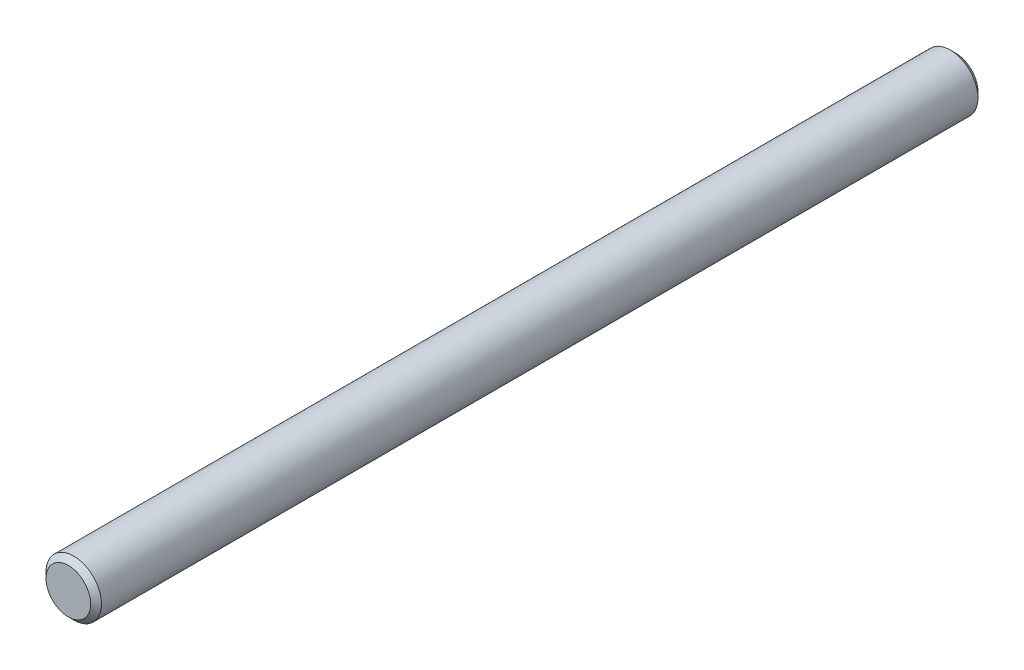
ISO-10303-21;
HEADER;
FILE_DESCRIPTION(('STEP AP214'),'2;1');
FILE_NAME('part.step','',(''),(''),'','','');
FILE_SCHEMA(('AUTOMOTIVE_DESIGN { 1 0 10303 214 1 1 1 1 }'));
ENDSEC;
DATA;
#1=APPLICATION_CONTEXT('core data for automotive mechanical design processes');
#2=APPLICATION_PROTOCOL_DEFINITION('international standard','automotive_design',2000,#1);
#3=PRODUCT_CONTEXT('',#1,'mechanical');
#4=PRODUCT('Part','Part','',(#3));
#5=PRODUCT_RELATED_PRODUCT_CATEGORY('part','',(#4));
#6=PRODUCT_DEFINITION_FORMATION('','',#4);
#7=PRODUCT_DEFINITION_CONTEXT('part definition',#1,'design');
#8=PRODUCT_DEFINITION('design','',#6,#7);
#9=PRODUCT_DEFINITION_SHAPE('','',#8);
#10=(LENGTH_UNIT() NAMED_UNIT(*) SI_UNIT(.MILLI.,.METRE.));
#11=(NAMED_UNIT(*) PLANE_ANGLE_UNIT() SI_UNIT($,.RADIAN.));
#12=(NAMED_UNIT(*) SI_UNIT($,.STERADIAN.) SOLID_ANGLE_UNIT());
#13=UNCERTAINTY_MEASURE_WITH_UNIT(LENGTH_MEASURE(1.E-05),#10,'distance_accuracy_value','');
#14=(GEOMETRIC_REPRESENTATION_CONTEXT(3) GLOBAL_UNCERTAINTY_ASSIGNED_CONTEXT((#13)) GLOBAL_UNIT_ASSIGNED_CONTEXT((#10,
#11,#12)) REPRESENTATION_CONTEXT('',''));
#15=CARTESIAN_POINT('',(0.,0.,0.));
#16=DIRECTION('',(0.,0.,1.));
#17=DIRECTION('',(1.,0.,0.));
#18=AXIS2_PLACEMENT_3D('',#15,#16,#17);
#19=CARTESIAN_POINT('',(0.,0.,40.));
#20=DIRECTION('',(0.,0.,-1.));
#21=DIRECTION('',(-1.,0.,0.));
#22=AXIS2_PLACEMENT_3D('',#19,#20,#21);
#23=PLANE('',#22);
#24=CARTESIAN_POINT('',(0.,0.,40.));
#25=DIRECTION('',(0.,0.,-1.));
#26=DIRECTION('',(-1.,0.,0.));
#27=AXIS2_PLACEMENT_3D('',#24,#25,#26);
#28=CIRCLE('',#27,1.0064375);
#29=CARTESIAN_POINT('',(-1.0064375,0.,40.));
#30=VERTEX_POINT('',#29);
#31=EDGE_CURVE('E10',#30,#30,#28,.T.);
#32=ORIENTED_EDGE('',*,*,#31,.F.);
#33=EDGE_LOOP('',(#32));
#34=FACE_BOUND('',#33,.T.);
#35=ADVANCED_FACE('F14',(#34),#23,.F.);
#36=CARTESIAN_POINT('',(0.,0.,40.));
#37=DIRECTION('',(0.,0.,-1.));
#38=DIRECTION('',(-1.,0.,0.));
#39=AXIS2_PLACEMENT_3D('',#36,#37,#38);
#40=CONICAL_SURFACE('',#39,1.0064375,0.785398163397442);
#41=CARTESIAN_POINT('',(0.,0.,39.7564375));
#42=DIRECTION('',(0.,0.,-1.));
#43=DIRECTION('',(-1.,0.,0.));
#44=AXIS2_PLACEMENT_3D('',#41,#42,#43);
#45=CIRCLE('',#44,1.25);
#46=CARTESIAN_POINT('',(-1.25,0.,39.7564375));
#47=VERTEX_POINT('',#46);
#48=EDGE_CURVE('E21',#47,#47,#45,.T.);
#49=ORIENTED_EDGE('',*,*,#48,.F.);
#50=EDGE_LOOP('',(#49));
#51=FACE_BOUND('',#50,.T.);
#52=ORIENTED_EDGE('',*,*,#31,.T.);
#53=EDGE_LOOP('',(#52));
#54=FACE_BOUND('',#53,.T.);
#55=ADVANCED_FACE('F56',(#51,#54),#40,.T.);
#56=CARTESIAN_POINT('',(0.,0.,0.));
#57=DIRECTION('',(0.,0.,-1.));
#58=DIRECTION('',(-1.,0.,0.));
#59=AXIS2_PLACEMENT_3D('',#56,#57,#58);
#60=CYLINDRICAL_SURFACE('',#59,1.25);
#61=CARTESIAN_POINT('',(0.,0.,0.2435625));
#62=DIRECTION('',(0.,0.,-1.));
#63=DIRECTION('',(-1.,0.,0.));
#64=AXIS2_PLACEMENT_3D('',#61,#62,#63);
#65=CIRCLE('',#64,1.25);
#66=CARTESIAN_POINT('',(-1.25,0.,0.2435625));
#67=VERTEX_POINT('',#66);
#68=EDGE_CURVE('E30',#67,#67,#65,.T.);
#69=ORIENTED_EDGE('',*,*,#68,.F.);
#70=EDGE_LOOP('',(#69));
#71=FACE_BOUND('',#70,.T.);
#72=ORIENTED_EDGE('',*,*,#48,.T.);
#73=EDGE_LOOP('',(#72));
#74=FACE_BOUND('',#73,.T.);
#75=ADVANCED_FACE('F51',(#71,#74),#60,.T.);
#76=CARTESIAN_POINT('',(0.,0.,0.2435625));
#77=DIRECTION('',(0.,0.,1.));
#78=DIRECTION('',(1.,0.,0.));
#79=AXIS2_PLACEMENT_3D('',#76,#77,#78);
#80=CONICAL_SURFACE('',#79,1.25,0.785398163397448);
#81=CARTESIAN_POINT('',(0.,0.,0.));
#82=DIRECTION('',(0.,0.,-1.));
#83=DIRECTION('',(-1.,0.,0.));
#84=AXIS2_PLACEMENT_3D('',#81,#82,#83);
#85=CIRCLE('',#84,1.0064375);
#86=CARTESIAN_POINT('',(-1.0064375,0.,0.));
#87=VERTEX_POINT('',#86);
#88=EDGE_CURVE('E37',#87,#87,#85,.T.);
#89=ORIENTED_EDGE('',*,*,#88,.F.);
#90=EDGE_LOOP('',(#89));
#91=FACE_BOUND('',#90,.T.);
#92=ORIENTED_EDGE('',*,*,#68,.T.);
#93=EDGE_LOOP('',(#92));
#94=FACE_BOUND('',#93,.T.);
#95=ADVANCED_FACE('F48',(#91,#94),#80,.T.);
#96=CARTESIAN_POINT('',(0.,1.0064375,0.));
#97=DIRECTION('',(0.,0.,1.));
#98=DIRECTION('',(1.,0.,0.));
#99=AXIS2_PLACEMENT_3D('',#96,#97,#98);
#100=PLANE('',#99);
#101=ORIENTED_EDGE('',*,*,#88,.T.);
#102=EDGE_LOOP('',(#101));
#103=FACE_BOUND('',#102,.T.);
#104=ADVANCED_FACE('F46',(#103),#100,.F.);
#105=CLOSED_SHELL('',(#35,#55,#75,#95,#104));
#106=MANIFOLD_SOLID_BREP('B1',#105);
#107=ADVANCED_BREP_SHAPE_REPRESENTATION('',(#18,#106),#14);
#108=SHAPE_DEFINITION_REPRESENTATION(#9,#107);
ENDSEC;
END-ISO-10303-21;
